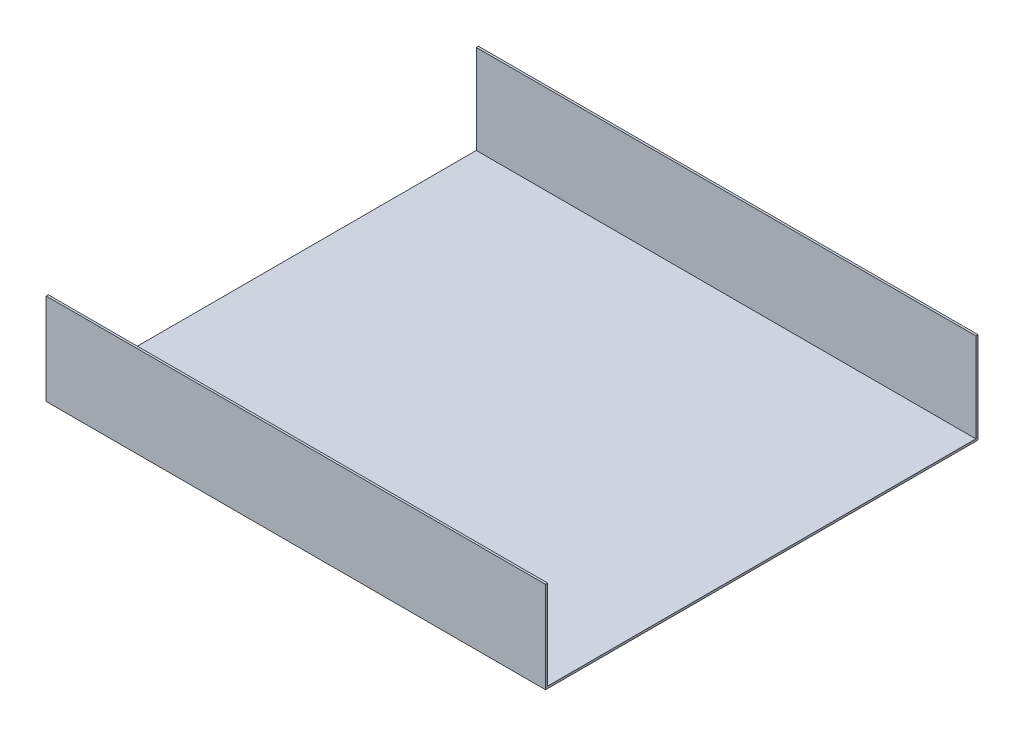
ISO-10303-21;
HEADER;
FILE_DESCRIPTION(('STEP AP214'),'2;1');
FILE_NAME('part.step','',(''),(''),'','','');
FILE_SCHEMA(('AUTOMOTIVE_DESIGN { 1 0 10303 214 1 1 1 1 }'));
ENDSEC;
DATA;
#1=APPLICATION_CONTEXT('core data for automotive mechanical design processes');
#2=APPLICATION_PROTOCOL_DEFINITION('international standard','automotive_design',2000,#1);
#3=PRODUCT_CONTEXT('',#1,'mechanical');
#4=PRODUCT('Part','Part','',(#3));
#5=PRODUCT_RELATED_PRODUCT_CATEGORY('part','',(#4));
#6=PRODUCT_DEFINITION_FORMATION('','',#4);
#7=PRODUCT_DEFINITION_CONTEXT('part definition',#1,'design');
#8=PRODUCT_DEFINITION('design','',#6,#7);
#9=PRODUCT_DEFINITION_SHAPE('','',#8);
#10=(LENGTH_UNIT() NAMED_UNIT(*) SI_UNIT(.MILLI.,.METRE.));
#11=(NAMED_UNIT(*) PLANE_ANGLE_UNIT() SI_UNIT($,.RADIAN.));
#12=(NAMED_UNIT(*) SI_UNIT($,.STERADIAN.) SOLID_ANGLE_UNIT());
#13=UNCERTAINTY_MEASURE_WITH_UNIT(LENGTH_MEASURE(1.E-05),#10,'distance_accuracy_value','');
#14=(GEOMETRIC_REPRESENTATION_CONTEXT(3) GLOBAL_UNCERTAINTY_ASSIGNED_CONTEXT((#13)) GLOBAL_UNIT_ASSIGNED_CONTEXT((#10,
#11,#12)) REPRESENTATION_CONTEXT('',''));
#15=CARTESIAN_POINT('',(0.,0.,0.));
#16=DIRECTION('',(0.,0.,1.));
#17=DIRECTION('',(1.,0.,0.));
#18=AXIS2_PLACEMENT_3D('',#15,#16,#17);
#19=CARTESIAN_POINT('',(140.,25.,0.));
#20=DIRECTION('',(0.,-1.,0.));
#21=DIRECTION('',(0.,0.,-1.));
#22=AXIS2_PLACEMENT_3D('',#19,#20,#21);
#23=PLANE('',#22);
#24=DIRECTION('',(-1.,0.,0.));
#25=VECTOR('',#24,1.);
#26=CARTESIAN_POINT('',(140.,25.,-120.));
#27=LINE('',#26,#25);
#28=CARTESIAN_POINT('',(140.,25.,-120.));
#29=VERTEX_POINT('',#28);
#30=CARTESIAN_POINT('',(0.,25.,-120.));
#31=VERTEX_POINT('',#30);
#32=EDGE_CURVE('E136',#29,#31,#27,.T.);
#33=ORIENTED_EDGE('',*,*,#32,.F.);
#34=DIRECTION('',(0.,0.,1.));
#35=VECTOR('',#34,1.);
#36=CARTESIAN_POINT('',(140.,25.,0.));
#37=LINE('',#36,#35);
#38=CARTESIAN_POINT('',(140.,25.,-120.6));
#39=VERTEX_POINT('',#38);
#40=EDGE_CURVE('E106',#39,#29,#37,.T.);
#41=ORIENTED_EDGE('',*,*,#40,.F.);
#42=DIRECTION('',(-1.,0.,0.));
#43=VECTOR('',#42,1.);
#44=CARTESIAN_POINT('',(140.,25.,-120.6));
#45=LINE('',#44,#43);
#46=CARTESIAN_POINT('',(0.,25.,-120.6));
#47=VERTEX_POINT('',#46);
#48=EDGE_CURVE('E116',#39,#47,#45,.T.);
#49=ORIENTED_EDGE('',*,*,#48,.T.);
#50=DIRECTION('',(0.,0.,1.));
#51=VECTOR('',#50,1.);
#52=CARTESIAN_POINT('',(0.,25.,0.));
#53=LINE('',#52,#51);
#54=EDGE_CURVE('E124',#47,#31,#53,.T.);
#55=ORIENTED_EDGE('',*,*,#54,.T.);
#56=EDGE_LOOP('',(#33,#41,#49,#55));
#57=FACE_BOUND('',#56,.T.);
#58=ADVANCED_FACE('F34',(#57),#23,.F.);
#59=CARTESIAN_POINT('',(140.,25.,0.));
#60=VERTEX_POINT('',#59);
#61=CARTESIAN_POINT('',(140.,25.,0.6));
#62=VERTEX_POINT('',#61);
#63=EDGE_CURVE('E105',#60,#62,#37,.T.);
#64=ORIENTED_EDGE('',*,*,#63,.F.);
#65=DIRECTION('',(-1.,0.,0.));
#66=VECTOR('',#65,1.);
#67=CARTESIAN_POINT('',(140.,25.,0.));
#68=LINE('',#67,#66);
#69=CARTESIAN_POINT('',(0.,25.,0.));
#70=VERTEX_POINT('',#69);
#71=EDGE_CURVE('E130',#60,#70,#68,.T.);
#72=ORIENTED_EDGE('',*,*,#71,.T.);
#73=CARTESIAN_POINT('',(0.,25.,0.6));
#74=VERTEX_POINT('',#73);
#75=EDGE_CURVE('E87',#70,#74,#53,.T.);
#76=ORIENTED_EDGE('',*,*,#75,.T.);
#77=DIRECTION('',(-1.,0.,0.));
#78=VECTOR('',#77,1.);
#79=CARTESIAN_POINT('',(140.,25.,0.6));
#80=LINE('',#79,#78);
#81=EDGE_CURVE('E11',#62,#74,#80,.T.);
#82=ORIENTED_EDGE('',*,*,#81,.F.);
#83=EDGE_LOOP('',(#64,#72,#76,#82));
#84=FACE_BOUND('',#83,.T.);
#85=ADVANCED_FACE('F178',(#84),#23,.F.);
#86=CARTESIAN_POINT('',(140.,25.,0.6));
#87=DIRECTION('',(0.,0.,-1.));
#88=DIRECTION('',(0.,1.,0.));
#89=AXIS2_PLACEMENT_3D('',#86,#87,#88);
#90=PLANE('',#89);
#91=DIRECTION('',(0.,-1.,0.));
#92=VECTOR('',#91,1.);
#93=CARTESIAN_POINT('',(0.,25.,0.6));
#94=LINE('',#93,#92);
#95=CARTESIAN_POINT('',(0.,-0.6,0.6));
#96=VERTEX_POINT('',#95);
#97=EDGE_CURVE('E78',#74,#96,#94,.T.);
#98=ORIENTED_EDGE('',*,*,#97,.T.);
#99=DIRECTION('',(-1.,0.,0.));
#100=VECTOR('',#99,1.);
#101=CARTESIAN_POINT('',(140.,-0.6,0.6));
#102=LINE('',#101,#100);
#103=CARTESIAN_POINT('',(140.,-0.6,0.6));
#104=VERTEX_POINT('',#103);
#105=EDGE_CURVE('E43',#104,#96,#102,.T.);
#106=ORIENTED_EDGE('',*,*,#105,.F.);
#107=DIRECTION('',(0.,-1.,0.));
#108=VECTOR('',#107,1.);
#109=CARTESIAN_POINT('',(140.,25.,0.6));
#110=LINE('',#109,#108);
#111=EDGE_CURVE('E98',#62,#104,#110,.T.);
#112=ORIENTED_EDGE('',*,*,#111,.F.);
#113=ORIENTED_EDGE('',*,*,#81,.T.);
#114=EDGE_LOOP('',(#98,#106,#112,#113));
#115=FACE_BOUND('',#114,.T.);
#116=ADVANCED_FACE('F108',(#115),#90,.F.);
#117=CARTESIAN_POINT('',(140.,-0.6,0.));
#118=DIRECTION('',(0.,1.,0.));
#119=DIRECTION('',(0.,0.,1.));
#120=AXIS2_PLACEMENT_3D('',#117,#118,#119);
#121=PLANE('',#120);
#122=DIRECTION('',(0.,0.,-1.));
#123=VECTOR('',#122,1.);
#124=CARTESIAN_POINT('',(0.,-0.6,0.));
#125=LINE('',#124,#123);
#126=CARTESIAN_POINT('',(0.,-0.6,-120.6));
#127=VERTEX_POINT('',#126);
#128=EDGE_CURVE('E38',#96,#127,#125,.T.);
#129=ORIENTED_EDGE('',*,*,#128,.T.);
#130=DIRECTION('',(-1.,0.,0.));
#131=VECTOR('',#130,1.);
#132=CARTESIAN_POINT('',(140.,-0.6,-120.6));
#133=LINE('',#132,#131);
#134=CARTESIAN_POINT('',(140.,-0.6,-120.6));
#135=VERTEX_POINT('',#134);
#136=EDGE_CURVE('E111',#135,#127,#133,.T.);
#137=ORIENTED_EDGE('',*,*,#136,.F.);
#138=DIRECTION('',(0.,0.,-1.));
#139=VECTOR('',#138,1.);
#140=CARTESIAN_POINT('',(140.,-0.6,0.));
#141=LINE('',#140,#139);
#142=EDGE_CURVE('E102',#104,#135,#141,.T.);
#143=ORIENTED_EDGE('',*,*,#142,.F.);
#144=ORIENTED_EDGE('',*,*,#105,.T.);
#145=EDGE_LOOP('',(#129,#137,#143,#144));
#146=FACE_BOUND('',#145,.T.);
#147=ADVANCED_FACE('F113',(#146),#121,.F.);
#148=CARTESIAN_POINT('',(140.,0.,-120.6));
#149=DIRECTION('',(0.,0.,1.));
#150=DIRECTION('',(1.,0.,0.));
#151=AXIS2_PLACEMENT_3D('',#148,#149,#150);
#152=PLANE('',#151);
#153=DIRECTION('',(0.,1.,0.));
#154=VECTOR('',#153,1.);
#155=CARTESIAN_POINT('',(0.,0.,-120.6));
#156=LINE('',#155,#154);
#157=EDGE_CURVE('E120',#127,#47,#156,.T.);
#158=ORIENTED_EDGE('',*,*,#157,.T.);
#159=ORIENTED_EDGE('',*,*,#48,.F.);
#160=DIRECTION('',(0.,1.,0.));
#161=VECTOR('',#160,1.);
#162=CARTESIAN_POINT('',(140.,0.,-120.6));
#163=LINE('',#162,#161);
#164=EDGE_CURVE('E60',#135,#39,#163,.T.);
#165=ORIENTED_EDGE('',*,*,#164,.F.);
#166=ORIENTED_EDGE('',*,*,#136,.T.);
#167=EDGE_LOOP('',(#158,#159,#165,#166));
#168=FACE_BOUND('',#167,.T.);
#169=ADVANCED_FACE('F36',(#168),#152,.F.);
#170=CARTESIAN_POINT('',(140.,0.,0.));
#171=DIRECTION('',(1.,0.,0.));
#172=DIRECTION('',(0.,0.,-1.));
#173=AXIS2_PLACEMENT_3D('',#170,#171,#172);
#174=PLANE('',#173);
#175=DIRECTION('',(0.,-1.,0.));
#176=VECTOR('',#175,1.);
#177=CARTESIAN_POINT('',(140.,25.,0.));
#178=LINE('',#177,#176);
#179=CARTESIAN_POINT('',(140.,0.,0.));
#180=VERTEX_POINT('',#179);
#181=EDGE_CURVE('E143',#60,#180,#178,.T.);
#182=ORIENTED_EDGE('',*,*,#181,.F.);
#183=ORIENTED_EDGE('',*,*,#63,.T.);
#184=ORIENTED_EDGE('',*,*,#111,.T.);
#185=ORIENTED_EDGE('',*,*,#142,.T.);
#186=ORIENTED_EDGE('',*,*,#164,.T.);
#187=ORIENTED_EDGE('',*,*,#40,.T.);
#188=DIRECTION('',(0.,1.,0.));
#189=VECTOR('',#188,1.);
#190=CARTESIAN_POINT('',(140.,0.,-120.));
#191=LINE('',#190,#189);
#192=CARTESIAN_POINT('',(140.,0.,-120.));
#193=VERTEX_POINT('',#192);
#194=EDGE_CURVE('E139',#193,#29,#191,.T.);
#195=ORIENTED_EDGE('',*,*,#194,.F.);
#196=DIRECTION('',(0.,0.,-1.));
#197=VECTOR('',#196,1.);
#198=CARTESIAN_POINT('',(140.,0.,0.));
#199=LINE('',#198,#197);
#200=EDGE_CURVE('E149',#180,#193,#199,.T.);
#201=ORIENTED_EDGE('',*,*,#200,.F.);
#202=EDGE_LOOP('',(#182,#183,#184,#185,#186,#187,#195,#201));
#203=FACE_BOUND('',#202,.T.);
#204=ADVANCED_FACE('F100',(#203),#174,.T.);
#205=CARTESIAN_POINT('',(0.,0.,0.));
#206=DIRECTION('',(1.,0.,0.));
#207=DIRECTION('',(0.,0.,-1.));
#208=AXIS2_PLACEMENT_3D('',#205,#206,#207);
#209=PLANE('',#208);
#210=DIRECTION('',(0.,0.,-1.));
#211=VECTOR('',#210,1.);
#212=CARTESIAN_POINT('',(0.,0.,0.));
#213=LINE('',#212,#211);
#214=CARTESIAN_POINT('',(0.,0.,0.));
#215=VERTEX_POINT('',#214);
#216=CARTESIAN_POINT('',(0.,0.,-120.));
#217=VERTEX_POINT('',#216);
#218=EDGE_CURVE('E51',#215,#217,#213,.T.);
#219=ORIENTED_EDGE('',*,*,#218,.T.);
#220=DIRECTION('',(0.,1.,0.));
#221=VECTOR('',#220,1.);
#222=CARTESIAN_POINT('',(0.,0.,-120.));
#223=LINE('',#222,#221);
#224=EDGE_CURVE('E140',#217,#31,#223,.T.);
#225=ORIENTED_EDGE('',*,*,#224,.T.);
#226=ORIENTED_EDGE('',*,*,#54,.F.);
#227=ORIENTED_EDGE('',*,*,#157,.F.);
#228=ORIENTED_EDGE('',*,*,#128,.F.);
#229=ORIENTED_EDGE('',*,*,#97,.F.);
#230=ORIENTED_EDGE('',*,*,#75,.F.);
#231=DIRECTION('',(0.,-1.,0.));
#232=VECTOR('',#231,1.);
#233=CARTESIAN_POINT('',(0.,25.,0.));
#234=LINE('',#233,#232);
#235=EDGE_CURVE('E145',#70,#215,#234,.T.);
#236=ORIENTED_EDGE('',*,*,#235,.T.);
#237=EDGE_LOOP('',(#219,#225,#226,#227,#228,#229,#230,#236));
#238=FACE_BOUND('',#237,.T.);
#239=ADVANCED_FACE('F174',(#238),#209,.F.);
#240=CARTESIAN_POINT('',(140.,25.,0.));
#241=DIRECTION('',(0.,0.,-1.));
#242=DIRECTION('',(0.,1.,0.));
#243=AXIS2_PLACEMENT_3D('',#240,#241,#242);
#244=PLANE('',#243);
#245=ORIENTED_EDGE('',*,*,#235,.F.);
#246=ORIENTED_EDGE('',*,*,#71,.F.);
#247=ORIENTED_EDGE('',*,*,#181,.T.);
#248=DIRECTION('',(-1.,0.,0.));
#249=VECTOR('',#248,1.);
#250=CARTESIAN_POINT('',(140.,0.,0.));
#251=LINE('',#250,#249);
#252=EDGE_CURVE('E132',#180,#215,#251,.T.);
#253=ORIENTED_EDGE('',*,*,#252,.T.);
#254=EDGE_LOOP('',(#245,#246,#247,#253));
#255=FACE_BOUND('',#254,.T.);
#256=ADVANCED_FACE('F157',(#255),#244,.T.);
#257=CARTESIAN_POINT('',(140.,0.,0.));
#258=DIRECTION('',(0.,1.,0.));
#259=DIRECTION('',(0.,0.,1.));
#260=AXIS2_PLACEMENT_3D('',#257,#258,#259);
#261=PLANE('',#260);
#262=ORIENTED_EDGE('',*,*,#218,.F.);
#263=ORIENTED_EDGE('',*,*,#252,.F.);
#264=ORIENTED_EDGE('',*,*,#200,.T.);
#265=DIRECTION('',(-1.,0.,0.));
#266=VECTOR('',#265,1.);
#267=CARTESIAN_POINT('',(140.,0.,-120.));
#268=LINE('',#267,#266);
#269=EDGE_CURVE('E134',#193,#217,#268,.T.);
#270=ORIENTED_EDGE('',*,*,#269,.T.);
#271=EDGE_LOOP('',(#262,#263,#264,#270));
#272=FACE_BOUND('',#271,.T.);
#273=ADVANCED_FACE('F161',(#272),#261,.T.);
#274=CARTESIAN_POINT('',(140.,0.,-120.));
#275=DIRECTION('',(0.,0.,1.));
#276=DIRECTION('',(1.,0.,0.));
#277=AXIS2_PLACEMENT_3D('',#274,#275,#276);
#278=PLANE('',#277);
#279=ORIENTED_EDGE('',*,*,#224,.F.);
#280=ORIENTED_EDGE('',*,*,#269,.F.);
#281=ORIENTED_EDGE('',*,*,#194,.T.);
#282=ORIENTED_EDGE('',*,*,#32,.T.);
#283=EDGE_LOOP('',(#279,#280,#281,#282));
#284=FACE_BOUND('',#283,.T.);
#285=ADVANCED_FACE('F169',(#284),#278,.T.);
#286=CLOSED_SHELL('',(#58,#85,#116,#147,#169,#204,#239,#256,#273,#285));
#287=MANIFOLD_SOLID_BREP('B2',#286);
#288=ADVANCED_BREP_SHAPE_REPRESENTATION('',(#18,#287),#14);
#289=SHAPE_DEFINITION_REPRESENTATION(#9,#288);
ENDSEC;
END-ISO-10303-21;
